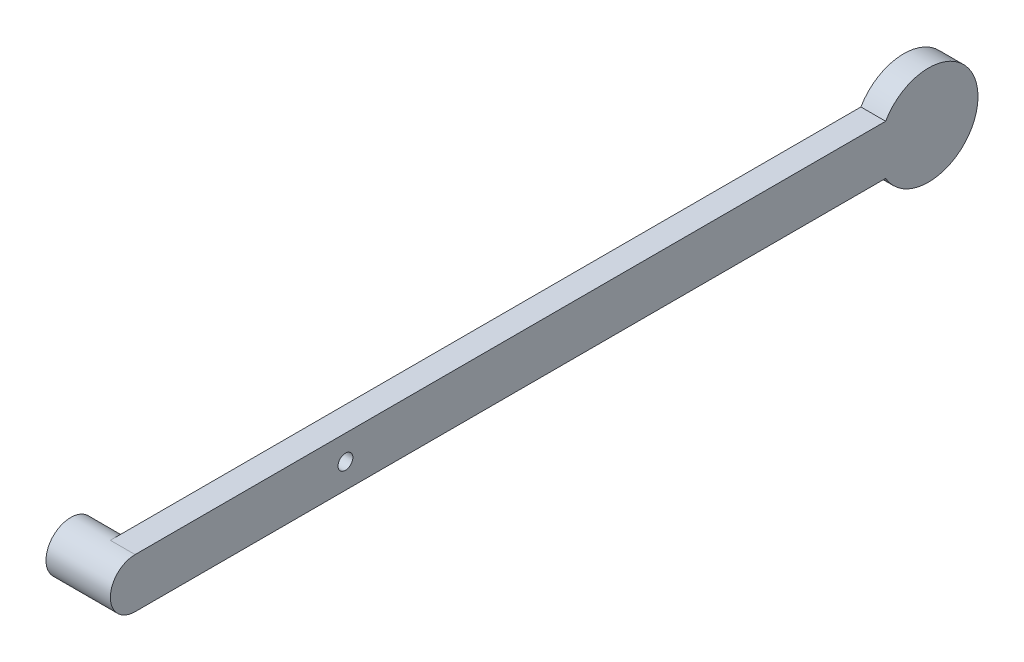
ISO-10303-21;
HEADER;
FILE_DESCRIPTION(('STEP AP214'),'2;1');
FILE_NAME('part.step','',(''),(''),'','','');
FILE_SCHEMA(('AUTOMOTIVE_DESIGN { 1 0 10303 214 1 1 1 1 }'));
ENDSEC;
DATA;
#1=APPLICATION_CONTEXT('core data for automotive mechanical design processes');
#2=APPLICATION_PROTOCOL_DEFINITION('international standard','automotive_design',2000,#1);
#3=PRODUCT_CONTEXT('',#1,'mechanical');
#4=PRODUCT('Part','Part','',(#3));
#5=PRODUCT_RELATED_PRODUCT_CATEGORY('part','',(#4));
#6=PRODUCT_DEFINITION_FORMATION('','',#4);
#7=PRODUCT_DEFINITION_CONTEXT('part definition',#1,'design');
#8=PRODUCT_DEFINITION('design','',#6,#7);
#9=PRODUCT_DEFINITION_SHAPE('','',#8);
#10=(LENGTH_UNIT() NAMED_UNIT(*) SI_UNIT(.MILLI.,.METRE.));
#11=(NAMED_UNIT(*) PLANE_ANGLE_UNIT() SI_UNIT($,.RADIAN.));
#12=(NAMED_UNIT(*) SI_UNIT($,.STERADIAN.) SOLID_ANGLE_UNIT());
#13=UNCERTAINTY_MEASURE_WITH_UNIT(LENGTH_MEASURE(1.E-05),#10,'distance_accuracy_value','');
#14=(GEOMETRIC_REPRESENTATION_CONTEXT(3) GLOBAL_UNCERTAINTY_ASSIGNED_CONTEXT((#13)) GLOBAL_UNIT_ASSIGNED_CONTEXT((#10,
#11,#12)) REPRESENTATION_CONTEXT('',''));
#15=CARTESIAN_POINT('',(0.,0.,0.));
#16=DIRECTION('',(0.,0.,1.));
#17=DIRECTION('',(1.,0.,0.));
#18=AXIS2_PLACEMENT_3D('',#15,#16,#17);
#19=CARTESIAN_POINT('',(0.,0.,42.5));
#20=DIRECTION('',(1.,0.,0.));
#21=DIRECTION('',(0.,0.,-1.));
#22=AXIS2_PLACEMENT_3D('',#19,#20,#21);
#23=PLANE('',#22);
#24=DIRECTION('',(0.,0.,1.));
#25=VECTOR('',#24,1.);
#26=CARTESIAN_POINT('',(0.,5.,42.5));
#27=LINE('',#26,#25);
#28=CARTESIAN_POINT('',(0.,5.00000000000002,-109.139745962156));
#29=VERTEX_POINT('',#28);
#30=CARTESIAN_POINT('',(0.,5.00000000000002,42.5));
#31=VERTEX_POINT('',#30);
#32=EDGE_CURVE('E87',#29,#31,#27,.T.);
#33=ORIENTED_EDGE('',*,*,#32,.F.);
#34=CARTESIAN_POINT('',(0.,0.,-117.8));
#35=DIRECTION('',(-1.,0.,0.));
#36=DIRECTION('',(0.,0.,1.));
#37=AXIS2_PLACEMENT_3D('',#34,#35,#36);
#38=CIRCLE('',#37,10.);
#39=CARTESIAN_POINT('',(0.,-4.99999999999998,-109.139745962156));
#40=VERTEX_POINT('',#39);
#41=EDGE_CURVE('E62',#29,#40,#38,.T.);
#42=ORIENTED_EDGE('',*,*,#41,.T.);
#43=DIRECTION('',(0.,0.,-1.));
#44=VECTOR('',#43,1.);
#45=CARTESIAN_POINT('',(0.,-5.,42.5));
#46=LINE('',#45,#44);
#47=CARTESIAN_POINT('',(0.,-5.,42.5));
#48=VERTEX_POINT('',#47);
#49=EDGE_CURVE('E104',#48,#40,#46,.T.);
#50=ORIENTED_EDGE('',*,*,#49,.F.);
#51=CARTESIAN_POINT('',(0.,0.,42.5));
#52=DIRECTION('',(-1.,0.,0.));
#53=DIRECTION('',(0.,0.,1.));
#54=AXIS2_PLACEMENT_3D('',#51,#52,#53);
#55=CIRCLE('',#54,5.00000000000002);
#56=EDGE_CURVE('E82',#31,#48,#55,.T.);
#57=ORIENTED_EDGE('',*,*,#56,.F.);
#58=EDGE_LOOP('',(#33,#42,#50,#57));
#59=FACE_BOUND('',#58,.T.);
#60=CARTESIAN_POINT('',(0.,0.,0.));
#61=DIRECTION('',(1.,0.,0.));
#62=DIRECTION('',(0.,0.,-1.));
#63=AXIS2_PLACEMENT_3D('',#60,#61,#62);
#64=CIRCLE('',#63,1.5);
#65=CARTESIAN_POINT('',(0.,0.,-1.5));
#66=VERTEX_POINT('',#65);
#67=EDGE_CURVE('E119',#66,#66,#64,.T.);
#68=ORIENTED_EDGE('',*,*,#67,.T.);
#69=EDGE_LOOP('',(#68));
#70=FACE_BOUND('',#69,.T.);
#71=ADVANCED_FACE('F44',(#59,#70),#23,.F.);
#72=CARTESIAN_POINT('',(5.,0.,42.5));
#73=DIRECTION('',(1.,0.,0.));
#74=DIRECTION('',(0.,0.,-1.));
#75=AXIS2_PLACEMENT_3D('',#72,#73,#74);
#76=PLANE('',#75);
#77=CARTESIAN_POINT('',(5.,0.,-117.8));
#78=DIRECTION('',(1.,0.,0.));
#79=DIRECTION('',(0.,0.,-1.));
#80=AXIS2_PLACEMENT_3D('',#77,#78,#79);
#81=CIRCLE('',#80,10.);
#82=CARTESIAN_POINT('',(5.,5.00000000000002,-109.139745962156));
#83=VERTEX_POINT('',#82);
#84=CARTESIAN_POINT('',(5.,-4.99999999999998,-109.139745962156));
#85=VERTEX_POINT('',#84);
#86=EDGE_CURVE('E100',#83,#85,#81,.F.);
#87=ORIENTED_EDGE('',*,*,#86,.F.);
#88=DIRECTION('',(0.,0.,1.));
#89=VECTOR('',#88,1.);
#90=CARTESIAN_POINT('',(5.,5.,42.5));
#91=LINE('',#90,#89);
#92=CARTESIAN_POINT('',(5.,5.,42.5));
#93=VERTEX_POINT('',#92);
#94=EDGE_CURVE('E69',#83,#93,#91,.T.);
#95=ORIENTED_EDGE('',*,*,#94,.T.);
#96=CARTESIAN_POINT('',(5.,0.,42.5));
#97=DIRECTION('',(1.,0.,0.));
#98=DIRECTION('',(0.,0.,-1.));
#99=AXIS2_PLACEMENT_3D('',#96,#97,#98);
#100=CIRCLE('',#99,5.);
#101=CARTESIAN_POINT('',(5.,-5.,42.5));
#102=VERTEX_POINT('',#101);
#103=EDGE_CURVE('E113',#93,#102,#100,.T.);
#104=ORIENTED_EDGE('',*,*,#103,.T.);
#105=DIRECTION('',(0.,0.,-1.));
#106=VECTOR('',#105,1.);
#107=CARTESIAN_POINT('',(5.,-5.,42.5));
#108=LINE('',#107,#106);
#109=EDGE_CURVE('E126',#102,#85,#108,.T.);
#110=ORIENTED_EDGE('',*,*,#109,.T.);
#111=EDGE_LOOP('',(#87,#95,#104,#110));
#112=FACE_BOUND('',#111,.T.);
#113=CARTESIAN_POINT('',(5.,0.,0.));
#114=DIRECTION('',(1.,0.,0.));
#115=DIRECTION('',(0.,0.,-1.));
#116=AXIS2_PLACEMENT_3D('',#113,#114,#115);
#117=CIRCLE('',#116,1.5);
#118=CARTESIAN_POINT('',(5.,0.,-1.5));
#119=VERTEX_POINT('',#118);
#120=EDGE_CURVE('E112',#119,#119,#117,.T.);
#121=ORIENTED_EDGE('',*,*,#120,.F.);
#122=EDGE_LOOP('',(#121));
#123=FACE_BOUND('',#122,.T.);
#124=ADVANCED_FACE('F146',(#112,#123),#76,.T.);
#125=CARTESIAN_POINT('',(5.,0.,42.5));
#126=DIRECTION('',(-1.,0.,0.));
#127=DIRECTION('',(0.,0.,1.));
#128=AXIS2_PLACEMENT_3D('',#125,#126,#127);
#129=CYLINDRICAL_SURFACE('',#128,5.);
#130=DIRECTION('',(-1.,0.,0.));
#131=VECTOR('',#130,1.);
#132=CARTESIAN_POINT('',(5.,5.,42.5));
#133=LINE('',#132,#131);
#134=EDGE_CURVE('E123',#93,#31,#133,.T.);
#135=ORIENTED_EDGE('',*,*,#134,.T.);
#136=ORIENTED_EDGE('',*,*,#56,.T.);
#137=DIRECTION('',(-1.,0.,0.));
#138=VECTOR('',#137,1.);
#139=CARTESIAN_POINT('',(5.,-5.,42.5));
#140=LINE('',#139,#138);
#141=EDGE_CURVE('E53',#102,#48,#140,.T.);
#142=ORIENTED_EDGE('',*,*,#141,.F.);
#143=ORIENTED_EDGE('',*,*,#103,.F.);
#144=EDGE_LOOP('',(#135,#136,#142,#143));
#145=FACE_BOUND('',#144,.T.);
#146=CARTESIAN_POINT('',(-8.,0.,42.5));
#147=DIRECTION('',(-1.,0.,0.));
#148=DIRECTION('',(0.,0.,1.));
#149=AXIS2_PLACEMENT_3D('',#146,#147,#148);
#150=CIRCLE('',#149,5.00000000000002);
#151=CARTESIAN_POINT('',(-8.,0.,47.5));
#152=VERTEX_POINT('',#151);
#153=EDGE_CURVE('E133',#152,#152,#150,.T.);
#154=ORIENTED_EDGE('',*,*,#153,.F.);
#155=EDGE_LOOP('',(#154));
#156=FACE_BOUND('',#155,.T.);
#157=ADVANCED_FACE('F50',(#145,#156),#129,.T.);
#158=CARTESIAN_POINT('',(5.,-5.,42.5));
#159=DIRECTION('',(0.,1.,0.));
#160=DIRECTION('',(0.,0.,1.));
#161=AXIS2_PLACEMENT_3D('',#158,#159,#160);
#162=PLANE('',#161);
#163=ORIENTED_EDGE('',*,*,#49,.T.);
#164=DIRECTION('',(-1.,0.,0.));
#165=VECTOR('',#164,1.);
#166=CARTESIAN_POINT('',(33.2842712474619,-4.99999999999998,-109.139745962156));
#167=LINE('',#166,#165);
#168=EDGE_CURVE('E92',#40,#85,#167,.F.);
#169=ORIENTED_EDGE('',*,*,#168,.T.);
#170=ORIENTED_EDGE('',*,*,#109,.F.);
#171=ORIENTED_EDGE('',*,*,#141,.T.);
#172=EDGE_LOOP('',(#163,#169,#170,#171));
#173=FACE_BOUND('',#172,.T.);
#174=ADVANCED_FACE('F108',(#173),#162,.F.);
#175=CARTESIAN_POINT('',(5.,5.,42.5));
#176=DIRECTION('',(0.,-1.,0.));
#177=DIRECTION('',(0.,0.,-1.));
#178=AXIS2_PLACEMENT_3D('',#175,#176,#177);
#179=PLANE('',#178);
#180=ORIENTED_EDGE('',*,*,#94,.F.);
#181=DIRECTION('',(-1.,0.,0.));
#182=VECTOR('',#181,1.);
#183=CARTESIAN_POINT('',(33.2842712474619,5.00000000000002,-109.139745962156));
#184=LINE('',#183,#182);
#185=EDGE_CURVE('E11',#83,#29,#184,.T.);
#186=ORIENTED_EDGE('',*,*,#185,.T.);
#187=ORIENTED_EDGE('',*,*,#32,.T.);
#188=ORIENTED_EDGE('',*,*,#134,.F.);
#189=EDGE_LOOP('',(#180,#186,#187,#188));
#190=FACE_BOUND('',#189,.T.);
#191=ADVANCED_FACE('F152',(#190),#179,.F.);
#192=CARTESIAN_POINT('',(5.,0.,0.));
#193=DIRECTION('',(-1.,0.,0.));
#194=DIRECTION('',(0.,0.,1.));
#195=AXIS2_PLACEMENT_3D('',#192,#193,#194);
#196=CYLINDRICAL_SURFACE('',#195,1.5);
#197=ORIENTED_EDGE('',*,*,#120,.T.);
#198=EDGE_LOOP('',(#197));
#199=FACE_BOUND('',#198,.T.);
#200=ORIENTED_EDGE('',*,*,#67,.F.);
#201=EDGE_LOOP('',(#200));
#202=FACE_BOUND('',#201,.T.);
#203=ADVANCED_FACE('F163',(#199,#202),#196,.F.);
#204=CARTESIAN_POINT('',(-8.,0.,42.5));
#205=DIRECTION('',(-1.,0.,0.));
#206=DIRECTION('',(0.,0.,1.));
#207=AXIS2_PLACEMENT_3D('',#204,#205,#206);
#208=PLANE('',#207);
#209=ORIENTED_EDGE('',*,*,#153,.T.);
#210=EDGE_LOOP('',(#209));
#211=FACE_BOUND('',#210,.T.);
#212=ADVANCED_FACE('F144',(#211),#208,.T.);
#213=CARTESIAN_POINT('',(33.2842712474619,0.,-117.8));
#214=DIRECTION('',(-1.,0.,0.));
#215=DIRECTION('',(0.,0.,1.));
#216=AXIS2_PLACEMENT_3D('',#213,#214,#215);
#217=CYLINDRICAL_SURFACE('',#216,10.);
#218=ORIENTED_EDGE('',*,*,#168,.F.);
#219=ORIENTED_EDGE('',*,*,#41,.F.);
#220=ORIENTED_EDGE('',*,*,#185,.F.);
#221=ORIENTED_EDGE('',*,*,#86,.T.);
#222=EDGE_LOOP('',(#218,#219,#220,#221));
#223=FACE_BOUND('',#222,.T.);
#224=ADVANCED_FACE('F96',(#223),#217,.T.);
#225=CLOSED_SHELL('',(#71,#124,#157,#174,#191,#203,#212,#224));
#226=MANIFOLD_SOLID_BREP('B2',#225);
#227=ADVANCED_BREP_SHAPE_REPRESENTATION('',(#18,#226),#14);
#228=SHAPE_DEFINITION_REPRESENTATION(#9,#227);
ENDSEC;
END-ISO-10303-21;
